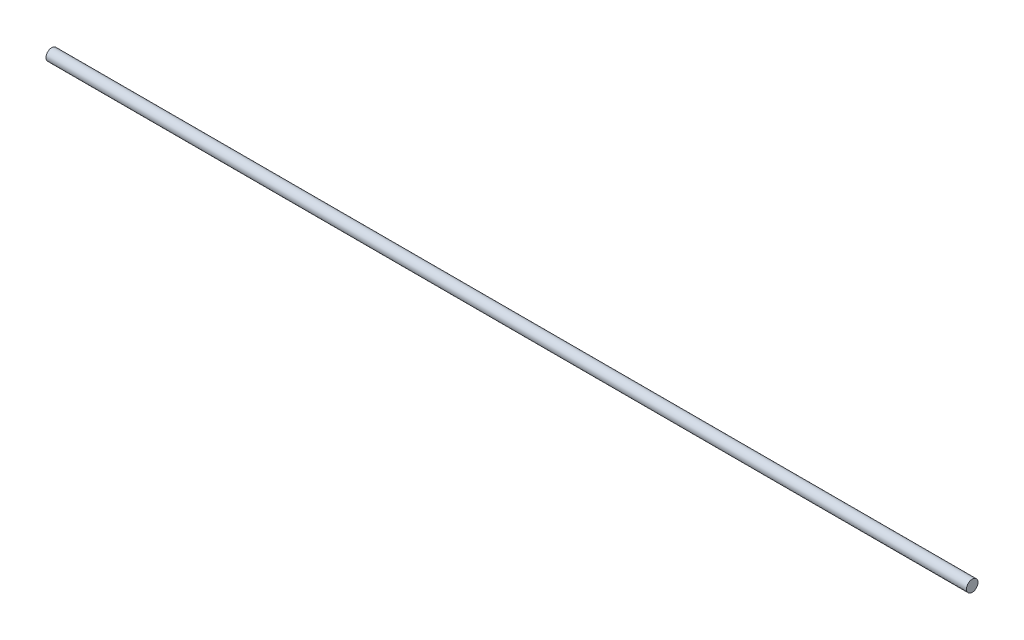
ISO-10303-21;
HEADER;
FILE_DESCRIPTION(('STEP AP214'),'2;1');
FILE_NAME('part.step','',(''),(''),'','','');
FILE_SCHEMA(('AUTOMOTIVE_DESIGN { 1 0 10303 214 1 1 1 1 }'));
ENDSEC;
DATA;
#1=APPLICATION_CONTEXT('core data for automotive mechanical design processes');
#2=APPLICATION_PROTOCOL_DEFINITION('international standard','automotive_design',2000,#1);
#3=PRODUCT_CONTEXT('',#1,'mechanical');
#4=PRODUCT('Part','Part','',(#3));
#5=PRODUCT_RELATED_PRODUCT_CATEGORY('part','',(#4));
#6=PRODUCT_DEFINITION_FORMATION('','',#4);
#7=PRODUCT_DEFINITION_CONTEXT('part definition',#1,'design');
#8=PRODUCT_DEFINITION('design','',#6,#7);
#9=PRODUCT_DEFINITION_SHAPE('','',#8);
#10=(LENGTH_UNIT() NAMED_UNIT(*) SI_UNIT(.MILLI.,.METRE.));
#11=(NAMED_UNIT(*) PLANE_ANGLE_UNIT() SI_UNIT($,.RADIAN.));
#12=(NAMED_UNIT(*) SI_UNIT($,.STERADIAN.) SOLID_ANGLE_UNIT());
#13=UNCERTAINTY_MEASURE_WITH_UNIT(LENGTH_MEASURE(1.E-05),#10,'distance_accuracy_value','');
#14=(GEOMETRIC_REPRESENTATION_CONTEXT(3) GLOBAL_UNCERTAINTY_ASSIGNED_CONTEXT((#13)) GLOBAL_UNIT_ASSIGNED_CONTEXT((#10,
#11,#12)) REPRESENTATION_CONTEXT('',''));
#15=CARTESIAN_POINT('',(0.,0.,0.));
#16=DIRECTION('',(0.,0.,1.));
#17=DIRECTION('',(1.,0.,0.));
#18=AXIS2_PLACEMENT_3D('',#15,#16,#17);
#19=CARTESIAN_POINT('',(800.,0.,0.));
#20=DIRECTION('',(-1.,0.,0.));
#21=DIRECTION('',(0.,0.,1.));
#22=AXIS2_PLACEMENT_3D('',#19,#20,#21);
#23=CYLINDRICAL_SURFACE('',#22,10.);
#24=CARTESIAN_POINT('',(800.,0.,0.));
#25=DIRECTION('',(1.,0.,0.));
#26=DIRECTION('',(0.,0.,-1.));
#27=AXIS2_PLACEMENT_3D('',#24,#25,#26);
#28=CIRCLE('',#27,10.);
#29=CARTESIAN_POINT('',(800.,0.,-10.));
#30=VERTEX_POINT('',#29);
#31=EDGE_CURVE('E10',#30,#30,#28,.T.);
#32=ORIENTED_EDGE('',*,*,#31,.F.);
#33=EDGE_LOOP('',(#32));
#34=FACE_BOUND('',#33,.T.);
#35=CARTESIAN_POINT('',(-800.,0.,0.));
#36=DIRECTION('',(1.,0.,0.));
#37=DIRECTION('',(0.,0.,-1.));
#38=AXIS2_PLACEMENT_3D('',#35,#36,#37);
#39=CIRCLE('',#38,10.);
#40=CARTESIAN_POINT('',(-800.,0.,-10.));
#41=VERTEX_POINT('',#40);
#42=EDGE_CURVE('E37',#41,#41,#39,.T.);
#43=ORIENTED_EDGE('',*,*,#42,.T.);
#44=EDGE_LOOP('',(#43));
#45=FACE_BOUND('',#44,.T.);
#46=ADVANCED_FACE('F34',(#34,#45),#23,.T.);
#47=CARTESIAN_POINT('',(800.,0.,0.));
#48=DIRECTION('',(1.,0.,0.));
#49=DIRECTION('',(0.,0.,-1.));
#50=AXIS2_PLACEMENT_3D('',#47,#48,#49);
#51=PLANE('',#50);
#52=ORIENTED_EDGE('',*,*,#31,.T.);
#53=EDGE_LOOP('',(#52));
#54=FACE_BOUND('',#53,.T.);
#55=ADVANCED_FACE('F49',(#54),#51,.T.);
#56=CARTESIAN_POINT('',(-800.,0.,0.));
#57=DIRECTION('',(1.,0.,0.));
#58=DIRECTION('',(0.,0.,-1.));
#59=AXIS2_PLACEMENT_3D('',#56,#57,#58);
#60=PLANE('',#59);
#61=ORIENTED_EDGE('',*,*,#42,.F.);
#62=EDGE_LOOP('',(#61));
#63=FACE_BOUND('',#62,.T.);
#64=ADVANCED_FACE('F47',(#63),#60,.F.);
#65=CLOSED_SHELL('',(#46,#55,#64));
#66=MANIFOLD_SOLID_BREP('B2',#65);
#67=ADVANCED_BREP_SHAPE_REPRESENTATION('',(#18,#66),#14);
#68=SHAPE_DEFINITION_REPRESENTATION(#9,#67);
ENDSEC;
END-ISO-10303-21;
